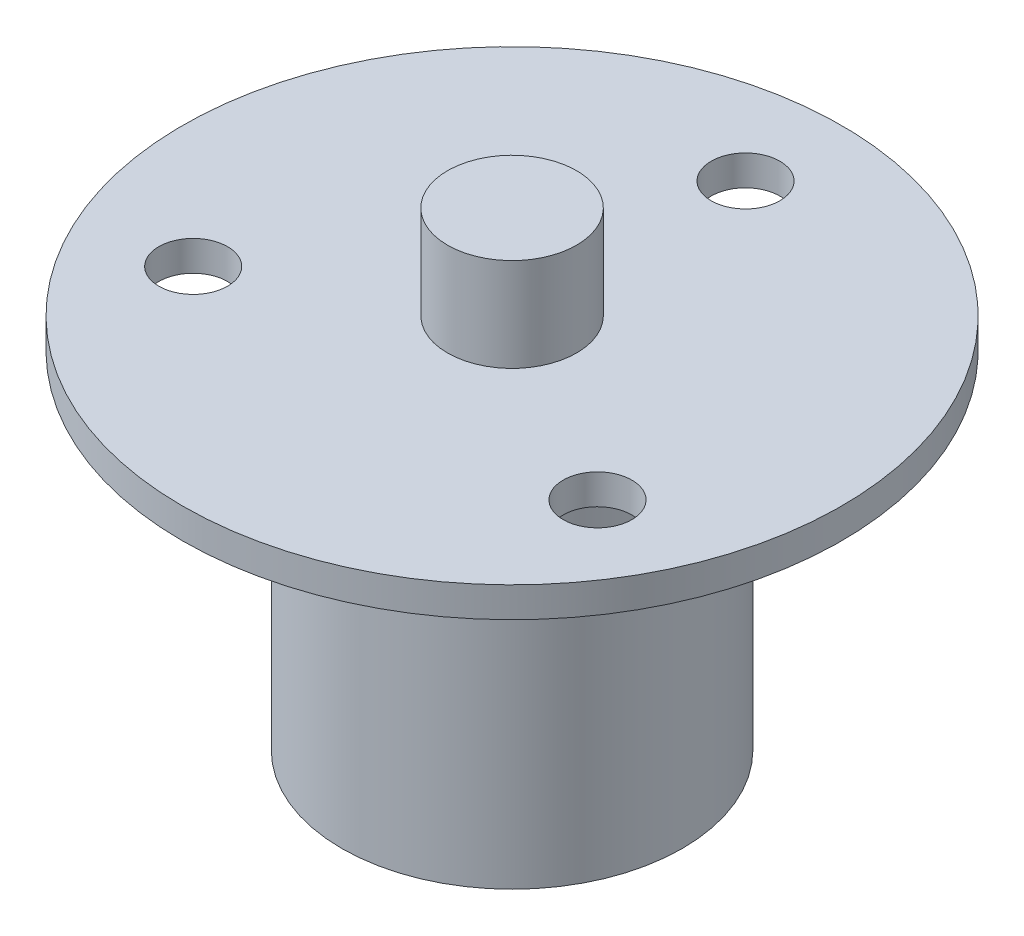
ISO-10303-21;
HEADER;
FILE_DESCRIPTION(('STEP AP214'),'2;1');
FILE_NAME('part.step','',(''),(''),'','','');
FILE_SCHEMA(('AUTOMOTIVE_DESIGN { 1 0 10303 214 1 1 1 1 }'));
ENDSEC;
DATA;
#1=APPLICATION_CONTEXT('core data for automotive mechanical design processes');
#2=APPLICATION_PROTOCOL_DEFINITION('international standard','automotive_design',2000,#1);
#3=PRODUCT_CONTEXT('',#1,'mechanical');
#4=PRODUCT('Part','Part','',(#3));
#5=PRODUCT_RELATED_PRODUCT_CATEGORY('part','',(#4));
#6=PRODUCT_DEFINITION_FORMATION('','',#4);
#7=PRODUCT_DEFINITION_CONTEXT('part definition',#1,'design');
#8=PRODUCT_DEFINITION('design','',#6,#7);
#9=PRODUCT_DEFINITION_SHAPE('','',#8);
#10=(LENGTH_UNIT() NAMED_UNIT(*) SI_UNIT(.MILLI.,.METRE.));
#11=(NAMED_UNIT(*) PLANE_ANGLE_UNIT() SI_UNIT($,.RADIAN.));
#12=(NAMED_UNIT(*) SI_UNIT($,.STERADIAN.) SOLID_ANGLE_UNIT());
#13=UNCERTAINTY_MEASURE_WITH_UNIT(LENGTH_MEASURE(1.E-05),#10,'distance_accuracy_value','');
#14=(GEOMETRIC_REPRESENTATION_CONTEXT(3) GLOBAL_UNCERTAINTY_ASSIGNED_CONTEXT((#13)) GLOBAL_UNIT_ASSIGNED_CONTEXT((#10,
#11,#12)) REPRESENTATION_CONTEXT('',''));
#15=CARTESIAN_POINT('',(0.,0.,0.));
#16=DIRECTION('',(0.,0.,1.));
#17=DIRECTION('',(1.,0.,0.));
#18=AXIS2_PLACEMENT_3D('',#15,#16,#17);
#19=CARTESIAN_POINT('',(0.,0.,0.));
#20=DIRECTION('',(0.,-1.,0.));
#21=DIRECTION('',(0.,0.,-1.));
#22=AXIS2_PLACEMENT_3D('',#19,#20,#21);
#23=PLANE('',#22);
#24=CARTESIAN_POINT('',(0.,0.,0.));
#25=DIRECTION('',(0.,1.,0.));
#26=DIRECTION('',(0.,0.,1.));
#27=AXIS2_PLACEMENT_3D('',#24,#25,#26);
#28=CIRCLE('',#27,6.2);
#29=CARTESIAN_POINT('',(0.,0.,6.2));
#30=VERTEX_POINT('',#29);
#31=EDGE_CURVE('E10',#30,#30,#28,.T.);
#32=ORIENTED_EDGE('',*,*,#31,.F.);
#33=EDGE_LOOP('',(#32));
#34=FACE_BOUND('',#33,.T.);
#35=ADVANCED_FACE('F33',(#34),#23,.T.);
#36=CARTESIAN_POINT('',(0.,17.1,0.));
#37=DIRECTION('',(0.,1.,0.));
#38=DIRECTION('',(0.,0.,1.));
#39=AXIS2_PLACEMENT_3D('',#36,#37,#38);
#40=CYLINDRICAL_SURFACE('',#39,6.2);
#41=ORIENTED_EDGE('',*,*,#31,.T.);
#42=EDGE_LOOP('',(#41));
#43=FACE_BOUND('',#42,.T.);
#44=CARTESIAN_POINT('',(0.,12.6,0.));
#45=DIRECTION('',(0.,1.,0.));
#46=DIRECTION('',(0.,0.,1.));
#47=AXIS2_PLACEMENT_3D('',#44,#45,#46);
#48=CIRCLE('',#47,6.2);
#49=CARTESIAN_POINT('',(0.,12.6,6.2));
#50=VERTEX_POINT('',#49);
#51=EDGE_CURVE('E39',#50,#50,#48,.T.);
#52=ORIENTED_EDGE('',*,*,#51,.F.);
#53=EDGE_LOOP('',(#52));
#54=FACE_BOUND('',#53,.T.);
#55=ADVANCED_FACE('F109',(#43,#54),#40,.T.);
#56=CARTESIAN_POINT('',(-6.2,12.6,0.));
#57=DIRECTION('',(0.,-1.,0.));
#58=DIRECTION('',(0.,0.,-1.));
#59=AXIS2_PLACEMENT_3D('',#56,#57,#58);
#60=PLANE('',#59);
#61=CARTESIAN_POINT('',(-7.36121593216719,12.6,4.25000000000032));
#62=DIRECTION('',(0.,-1.,0.));
#63=DIRECTION('',(0.,0.,-1.));
#64=AXIS2_PLACEMENT_3D('',#61,#62,#63);
#65=CIRCLE('',#64,1.25000000000069);
#66=CARTESIAN_POINT('',(-7.36121593216719,12.6,5.500000000001));
#67=VERTEX_POINT('',#66);
#68=EDGE_CURVE('E71',#67,#67,#65,.F.);
#69=ORIENTED_EDGE('',*,*,#68,.T.);
#70=EDGE_LOOP('',(#69));
#71=FACE_BOUND('',#70,.T.);
#72=CARTESIAN_POINT('',(7.36121593216827,12.6,4.24999999999969));
#73=DIRECTION('',(0.,-1.,0.));
#74=DIRECTION('',(0.,0.,-1.));
#75=AXIS2_PLACEMENT_3D('',#72,#73,#74);
#76=CIRCLE('',#75,1.25000000000047);
#77=CARTESIAN_POINT('',(7.36121593216827,12.6,5.50000000000015));
#78=VERTEX_POINT('',#77);
#79=EDGE_CURVE('E65',#78,#78,#76,.F.);
#80=ORIENTED_EDGE('',*,*,#79,.T.);
#81=EDGE_LOOP('',(#80));
#82=FACE_BOUND('',#81,.T.);
#83=CARTESIAN_POINT('',(0.,12.6,-8.5));
#84=DIRECTION('',(0.,-1.,0.));
#85=DIRECTION('',(0.,0.,-1.));
#86=AXIS2_PLACEMENT_3D('',#83,#84,#85);
#87=CIRCLE('',#86,1.25);
#88=CARTESIAN_POINT('',(0.,12.6,-7.25));
#89=VERTEX_POINT('',#88);
#90=EDGE_CURVE('E59',#89,#89,#87,.F.);
#91=ORIENTED_EDGE('',*,*,#90,.T.);
#92=EDGE_LOOP('',(#91));
#93=FACE_BOUND('',#92,.T.);
#94=ORIENTED_EDGE('',*,*,#51,.T.);
#95=EDGE_LOOP('',(#94));
#96=FACE_BOUND('',#95,.T.);
#97=CARTESIAN_POINT('',(0.,12.6,0.));
#98=DIRECTION('',(0.,1.,0.));
#99=DIRECTION('',(0.,0.,1.));
#100=AXIS2_PLACEMENT_3D('',#97,#98,#99);
#101=CIRCLE('',#100,12.);
#102=CARTESIAN_POINT('',(0.,12.6,12.));
#103=VERTEX_POINT('',#102);
#104=EDGE_CURVE('E43',#103,#103,#101,.T.);
#105=ORIENTED_EDGE('',*,*,#104,.F.);
#106=EDGE_LOOP('',(#105));
#107=FACE_BOUND('',#106,.T.);
#108=ADVANCED_FACE('F114',(#71,#82,#93,#96,#107),#60,.T.);
#109=CARTESIAN_POINT('',(0.,17.1,0.));
#110=DIRECTION('',(0.,1.,0.));
#111=DIRECTION('',(0.,0.,1.));
#112=AXIS2_PLACEMENT_3D('',#109,#110,#111);
#113=CYLINDRICAL_SURFACE('',#112,12.);
#114=ORIENTED_EDGE('',*,*,#104,.T.);
#115=EDGE_LOOP('',(#114));
#116=FACE_BOUND('',#115,.T.);
#117=CARTESIAN_POINT('',(0.,13.7,0.));
#118=DIRECTION('',(0.,1.,0.));
#119=DIRECTION('',(0.,0.,1.));
#120=AXIS2_PLACEMENT_3D('',#117,#118,#119);
#121=CIRCLE('',#120,12.);
#122=CARTESIAN_POINT('',(0.,13.7,12.));
#123=VERTEX_POINT('',#122);
#124=EDGE_CURVE('E47',#123,#123,#121,.T.);
#125=ORIENTED_EDGE('',*,*,#124,.F.);
#126=EDGE_LOOP('',(#125));
#127=FACE_BOUND('',#126,.T.);
#128=ADVANCED_FACE('F83',(#116,#127),#113,.T.);
#129=CARTESIAN_POINT('',(-12.,13.7,0.));
#130=DIRECTION('',(0.,1.,0.));
#131=DIRECTION('',(0.,0.,1.));
#132=AXIS2_PLACEMENT_3D('',#129,#130,#131);
#133=PLANE('',#132);
#134=CARTESIAN_POINT('',(-7.36121593216719,13.7,4.25000000000032));
#135=DIRECTION('',(0.,1.,0.));
#136=DIRECTION('',(0.,0.,1.));
#137=AXIS2_PLACEMENT_3D('',#134,#135,#136);
#138=CIRCLE('',#137,1.25000000000069);
#139=CARTESIAN_POINT('',(-7.36121593216719,13.7,5.500000000001));
#140=VERTEX_POINT('',#139);
#141=EDGE_CURVE('E68',#140,#140,#138,.T.);
#142=ORIENTED_EDGE('',*,*,#141,.F.);
#143=EDGE_LOOP('',(#142));
#144=FACE_BOUND('',#143,.T.);
#145=CARTESIAN_POINT('',(7.36121593216827,13.7,4.24999999999969));
#146=DIRECTION('',(0.,1.,0.));
#147=DIRECTION('',(0.,0.,1.));
#148=AXIS2_PLACEMENT_3D('',#145,#146,#147);
#149=CIRCLE('',#148,1.25000000000047);
#150=CARTESIAN_POINT('',(7.36121593216827,13.7,5.50000000000015));
#151=VERTEX_POINT('',#150);
#152=EDGE_CURVE('E62',#151,#151,#149,.T.);
#153=ORIENTED_EDGE('',*,*,#152,.F.);
#154=EDGE_LOOP('',(#153));
#155=FACE_BOUND('',#154,.T.);
#156=CARTESIAN_POINT('',(0.,13.7,-8.5));
#157=DIRECTION('',(0.,1.,0.));
#158=DIRECTION('',(0.,0.,1.));
#159=AXIS2_PLACEMENT_3D('',#156,#157,#158);
#160=CIRCLE('',#159,1.25);
#161=CARTESIAN_POINT('',(0.,13.7,-7.25));
#162=VERTEX_POINT('',#161);
#163=EDGE_CURVE('E58',#162,#162,#160,.T.);
#164=ORIENTED_EDGE('',*,*,#163,.F.);
#165=EDGE_LOOP('',(#164));
#166=FACE_BOUND('',#165,.T.);
#167=ORIENTED_EDGE('',*,*,#124,.T.);
#168=EDGE_LOOP('',(#167));
#169=FACE_BOUND('',#168,.T.);
#170=CARTESIAN_POINT('',(0.,13.7,0.));
#171=DIRECTION('',(0.,1.,0.));
#172=DIRECTION('',(0.,0.,1.));
#173=AXIS2_PLACEMENT_3D('',#170,#171,#172);
#174=CIRCLE('',#173,2.35);
#175=CARTESIAN_POINT('',(0.,13.7,2.35));
#176=VERTEX_POINT('',#175);
#177=EDGE_CURVE('E52',#176,#176,#174,.T.);
#178=ORIENTED_EDGE('',*,*,#177,.F.);
#179=EDGE_LOOP('',(#178));
#180=FACE_BOUND('',#179,.T.);
#181=ADVANCED_FACE('F79',(#144,#155,#166,#169,#180),#133,.T.);
#182=CARTESIAN_POINT('',(0.,17.1,0.));
#183=DIRECTION('',(0.,1.,0.));
#184=DIRECTION('',(0.,0.,1.));
#185=AXIS2_PLACEMENT_3D('',#182,#183,#184);
#186=CYLINDRICAL_SURFACE('',#185,2.35);
#187=ORIENTED_EDGE('',*,*,#177,.T.);
#188=EDGE_LOOP('',(#187));
#189=FACE_BOUND('',#188,.T.);
#190=CARTESIAN_POINT('',(0.,17.1,0.));
#191=DIRECTION('',(0.,1.,0.));
#192=DIRECTION('',(0.,0.,1.));
#193=AXIS2_PLACEMENT_3D('',#190,#191,#192);
#194=CIRCLE('',#193,2.35);
#195=CARTESIAN_POINT('',(0.,17.1,2.35));
#196=VERTEX_POINT('',#195);
#197=EDGE_CURVE('E55',#196,#196,#194,.T.);
#198=ORIENTED_EDGE('',*,*,#197,.F.);
#199=EDGE_LOOP('',(#198));
#200=FACE_BOUND('',#199,.T.);
#201=ADVANCED_FACE('F82',(#189,#200),#186,.T.);
#202=CARTESIAN_POINT('',(-2.35,17.1,0.));
#203=DIRECTION('',(0.,1.,0.));
#204=DIRECTION('',(0.,0.,1.));
#205=AXIS2_PLACEMENT_3D('',#202,#203,#204);
#206=PLANE('',#205);
#207=ORIENTED_EDGE('',*,*,#197,.T.);
#208=EDGE_LOOP('',(#207));
#209=FACE_BOUND('',#208,.T.);
#210=ADVANCED_FACE('F95',(#209),#206,.T.);
#211=CARTESIAN_POINT('',(0.,-0.000999999999999265,-8.5));
#212=DIRECTION('',(0.,1.,0.));
#213=DIRECTION('',(0.,0.,1.));
#214=AXIS2_PLACEMENT_3D('',#211,#212,#213);
#215=CYLINDRICAL_SURFACE('',#214,1.25);
#216=CARTESIAN_POINT('',(0.,12.6,-7.25));
#217=CARTESIAN_POINT('',(0.,12.6114583333333,-7.25));
#218=CARTESIAN_POINT('',(0.,12.6229166666667,-7.25));
#219=CARTESIAN_POINT('',(0.,12.6458333333333,-7.25));
#220=CARTESIAN_POINT('',(0.,12.6572916666667,-7.25));
#221=CARTESIAN_POINT('',(0.,12.6802083333333,-7.25));
#222=CARTESIAN_POINT('',(0.,12.6916666666667,-7.25));
#223=CARTESIAN_POINT('',(0.,12.7145833333333,-7.25));
#224=CARTESIAN_POINT('',(0.,12.7260416666667,-7.25));
#225=CARTESIAN_POINT('',(0.,12.7489583333333,-7.25));
#226=CARTESIAN_POINT('',(0.,12.7604166666667,-7.25));
#227=CARTESIAN_POINT('',(0.,12.7833333333333,-7.25));
#228=CARTESIAN_POINT('',(0.,12.7947916666667,-7.25));
#229=CARTESIAN_POINT('',(0.,12.8177083333333,-7.25));
#230=CARTESIAN_POINT('',(0.,12.8291666666667,-7.25));
#231=CARTESIAN_POINT('',(0.,12.8520833333333,-7.25));
#232=CARTESIAN_POINT('',(0.,12.8635416666667,-7.25));
#233=CARTESIAN_POINT('',(0.,12.8864583333333,-7.25));
#234=CARTESIAN_POINT('',(0.,12.8979166666667,-7.25));
#235=CARTESIAN_POINT('',(0.,12.9208333333333,-7.25));
#236=CARTESIAN_POINT('',(0.,12.9322916666667,-7.25));
#237=CARTESIAN_POINT('',(0.,12.9552083333333,-7.25));
#238=CARTESIAN_POINT('',(0.,12.9666666666667,-7.25));
#239=CARTESIAN_POINT('',(0.,12.9895833333333,-7.25));
#240=CARTESIAN_POINT('',(0.,13.0010416666667,-7.25));
#241=CARTESIAN_POINT('',(0.,13.0239583333333,-7.25));
#242=CARTESIAN_POINT('',(0.,13.0354166666667,-7.25));
#243=CARTESIAN_POINT('',(0.,13.0583333333333,-7.25));
#244=CARTESIAN_POINT('',(0.,13.0697916666667,-7.25));
#245=CARTESIAN_POINT('',(0.,13.0927083333333,-7.25));
#246=CARTESIAN_POINT('',(0.,13.1041666666667,-7.25));
#247=CARTESIAN_POINT('',(0.,13.1270833333333,-7.25));
#248=CARTESIAN_POINT('',(0.,13.1385416666667,-7.25));
#249=CARTESIAN_POINT('',(0.,13.1614583333333,-7.25));
#250=CARTESIAN_POINT('',(0.,13.1729166666667,-7.25));
#251=CARTESIAN_POINT('',(0.,13.1958333333333,-7.25));
#252=CARTESIAN_POINT('',(0.,13.2072916666667,-7.25));
#253=CARTESIAN_POINT('',(0.,13.2302083333333,-7.25));
#254=CARTESIAN_POINT('',(0.,13.2416666666667,-7.25));
#255=CARTESIAN_POINT('',(0.,13.2645833333333,-7.25));
#256=CARTESIAN_POINT('',(0.,13.2760416666667,-7.25));
#257=CARTESIAN_POINT('',(0.,13.2989583333333,-7.25));
#258=CARTESIAN_POINT('',(0.,13.3104166666667,-7.25));
#259=CARTESIAN_POINT('',(0.,13.3333333333333,-7.25));
#260=CARTESIAN_POINT('',(0.,13.3447916666667,-7.25));
#261=CARTESIAN_POINT('',(0.,13.3677083333333,-7.25));
#262=CARTESIAN_POINT('',(0.,13.3791666666667,-7.25));
#263=CARTESIAN_POINT('',(0.,13.4020833333333,-7.25));
#264=CARTESIAN_POINT('',(0.,13.4135416666667,-7.25));
#265=CARTESIAN_POINT('',(0.,13.4364583333333,-7.25));
#266=CARTESIAN_POINT('',(0.,13.4479166666667,-7.25));
#267=CARTESIAN_POINT('',(0.,13.4708333333333,-7.25));
#268=CARTESIAN_POINT('',(0.,13.4822916666667,-7.25));
#269=CARTESIAN_POINT('',(0.,13.5052083333333,-7.25));
#270=CARTESIAN_POINT('',(0.,13.5166666666667,-7.25));
#271=CARTESIAN_POINT('',(0.,13.5395833333333,-7.25));
#272=CARTESIAN_POINT('',(0.,13.5510416666667,-7.25));
#273=CARTESIAN_POINT('',(0.,13.5739583333333,-7.25));
#274=CARTESIAN_POINT('',(0.,13.5854166666667,-7.25));
#275=CARTESIAN_POINT('',(0.,13.6083333333333,-7.25));
#276=CARTESIAN_POINT('',(0.,13.6197916666667,-7.25));
#277=CARTESIAN_POINT('',(0.,13.6427083333333,-7.25));
#278=CARTESIAN_POINT('',(0.,13.6541666666667,-7.25));
#279=CARTESIAN_POINT('',(0.,13.6770833333333,-7.25));
#280=CARTESIAN_POINT('',(0.,13.6885416666667,-7.25));
#281=CARTESIAN_POINT('',(0.,13.7,-7.25));
#282=B_SPLINE_CURVE_WITH_KNOTS('',3,(#216,#217,#218,#219,#220,#221,#222,#223,#224,#225,#226,
#227,#228,#229,#230,#231,#232,#233,#234,#235,#236,#237,#238,#239,#240,#241,#242,#243,#244,#245,
#246,#247,#248,#249,#250,#251,#252,#253,#254,#255,#256,#257,#258,#259,#260,#261,#262,#263,#264,
#265,#266,#267,#268,#269,#270,#271,#272,#273,#274,#275,#276,#277,#278,#279,#280,#281),
.UNSPECIFIED.,.F.,.F.,(4,2,2,2,2,2,2,2,2,2,2,2,2,2,2,2,2,2,2,2,2,2,2,2,2,2,2,2,2,2,2,2,4),(0.,
0.0343749999999997,0.0687499999999994,0.103125000000001,0.1375,0.171875,0.20625,0.240625,
0.275000000000001,0.309375000000001,0.34375,0.378125,0.4125,0.446874999999999,0.481250000000001,
0.515625,0.55,0.584375,0.618749999999999,0.653125000000001,0.687500000000001,0.721875,0.75625,
0.790625,0.824999999999999,0.859375000000001,0.89375,0.928125,0.9625,0.996875000000001,1.03125,
1.065625,1.1),.UNSPECIFIED.);
#283=EDGE_CURVE('BSEAM100',#89,#162,#282,.T.);
#284=ORIENTED_EDGE('',*,*,#90,.F.);
#285=ORIENTED_EDGE('',*,*,#163,.T.);
#286=ORIENTED_EDGE('',*,*,#283,.T.);
#287=ORIENTED_EDGE('',*,*,#283,.F.);
#288=EDGE_LOOP('',(#284,#286,#285,#287));
#289=FACE_BOUND('',#288,.T.);
#290=ADVANCED_FACE('F100',(#289),#215,.F.);
#291=CARTESIAN_POINT('',(7.36121593216827,-0.000999999999999265,4.24999999999969));
#292=DIRECTION('',(0.,1.,0.));
#293=DIRECTION('',(0.,0.,1.));
#294=AXIS2_PLACEMENT_3D('',#291,#292,#293);
#295=CYLINDRICAL_SURFACE('',#294,1.25000000000047);
#296=CARTESIAN_POINT('',(7.36121593216827,12.6,5.50000000000015));
#297=CARTESIAN_POINT('',(7.36121593216827,12.6114583333333,5.50000000000015));
#298=CARTESIAN_POINT('',(7.36121593216827,12.6229166666667,5.50000000000015));
#299=CARTESIAN_POINT('',(7.36121593216827,12.6458333333333,5.50000000000015));
#300=CARTESIAN_POINT('',(7.36121593216827,12.6572916666667,5.50000000000015));
#301=CARTESIAN_POINT('',(7.36121593216827,12.6802083333333,5.50000000000015));
#302=CARTESIAN_POINT('',(7.36121593216827,12.6916666666667,5.50000000000015));
#303=CARTESIAN_POINT('',(7.36121593216827,12.7145833333333,5.50000000000015));
#304=CARTESIAN_POINT('',(7.36121593216827,12.7260416666667,5.50000000000015));
#305=CARTESIAN_POINT('',(7.36121593216827,12.7489583333333,5.50000000000015));
#306=CARTESIAN_POINT('',(7.36121593216827,12.7604166666667,5.50000000000015));
#307=CARTESIAN_POINT('',(7.36121593216827,12.7833333333333,5.50000000000015));
#308=CARTESIAN_POINT('',(7.36121593216827,12.7947916666667,5.50000000000015));
#309=CARTESIAN_POINT('',(7.36121593216827,12.8177083333333,5.50000000000015));
#310=CARTESIAN_POINT('',(7.36121593216827,12.8291666666667,5.50000000000015));
#311=CARTESIAN_POINT('',(7.36121593216827,12.8520833333333,5.50000000000015));
#312=CARTESIAN_POINT('',(7.36121593216827,12.8635416666667,5.50000000000015));
#313=CARTESIAN_POINT('',(7.36121593216827,12.8864583333333,5.50000000000015));
#314=CARTESIAN_POINT('',(7.36121593216827,12.8979166666667,5.50000000000015));
#315=CARTESIAN_POINT('',(7.36121593216827,12.9208333333333,5.50000000000015));
#316=CARTESIAN_POINT('',(7.36121593216827,12.9322916666667,5.50000000000015));
#317=CARTESIAN_POINT('',(7.36121593216827,12.9552083333333,5.50000000000015));
#318=CARTESIAN_POINT('',(7.36121593216827,12.9666666666667,5.50000000000015));
#319=CARTESIAN_POINT('',(7.36121593216827,12.9895833333333,5.50000000000015));
#320=CARTESIAN_POINT('',(7.36121593216827,13.0010416666667,5.50000000000015));
#321=CARTESIAN_POINT('',(7.36121593216827,13.0239583333333,5.50000000000015));
#322=CARTESIAN_POINT('',(7.36121593216827,13.0354166666667,5.50000000000015));
#323=CARTESIAN_POINT('',(7.36121593216827,13.0583333333333,5.50000000000015));
#324=CARTESIAN_POINT('',(7.36121593216827,13.0697916666667,5.50000000000015));
#325=CARTESIAN_POINT('',(7.36121593216827,13.0927083333333,5.50000000000015));
#326=CARTESIAN_POINT('',(7.36121593216827,13.1041666666667,5.50000000000015));
#327=CARTESIAN_POINT('',(7.36121593216827,13.1270833333333,5.50000000000015));
#328=CARTESIAN_POINT('',(7.36121593216827,13.1385416666667,5.50000000000015));
#329=CARTESIAN_POINT('',(7.36121593216827,13.1614583333333,5.50000000000015));
#330=CARTESIAN_POINT('',(7.36121593216827,13.1729166666667,5.50000000000015));
#331=CARTESIAN_POINT('',(7.36121593216827,13.1958333333333,5.50000000000015));
#332=CARTESIAN_POINT('',(7.36121593216827,13.2072916666667,5.50000000000015));
#333=CARTESIAN_POINT('',(7.36121593216827,13.2302083333333,5.50000000000015));
#334=CARTESIAN_POINT('',(7.36121593216827,13.2416666666667,5.50000000000015));
#335=CARTESIAN_POINT('',(7.36121593216827,13.2645833333333,5.50000000000015));
#336=CARTESIAN_POINT('',(7.36121593216827,13.2760416666667,5.50000000000015));
#337=CARTESIAN_POINT('',(7.36121593216827,13.2989583333333,5.50000000000015));
#338=CARTESIAN_POINT('',(7.36121593216827,13.3104166666667,5.50000000000015));
#339=CARTESIAN_POINT('',(7.36121593216827,13.3333333333333,5.50000000000015));
#340=CARTESIAN_POINT('',(7.36121593216827,13.3447916666667,5.50000000000015));
#341=CARTESIAN_POINT('',(7.36121593216827,13.3677083333333,5.50000000000015));
#342=CARTESIAN_POINT('',(7.36121593216827,13.3791666666667,5.50000000000015));
#343=CARTESIAN_POINT('',(7.36121593216827,13.4020833333333,5.50000000000015));
#344=CARTESIAN_POINT('',(7.36121593216827,13.4135416666667,5.50000000000015));
#345=CARTESIAN_POINT('',(7.36121593216827,13.4364583333333,5.50000000000015));
#346=CARTESIAN_POINT('',(7.36121593216827,13.4479166666667,5.50000000000015));
#347=CARTESIAN_POINT('',(7.36121593216827,13.4708333333333,5.50000000000015));
#348=CARTESIAN_POINT('',(7.36121593216827,13.4822916666667,5.50000000000015));
#349=CARTESIAN_POINT('',(7.36121593216827,13.5052083333333,5.50000000000015));
#350=CARTESIAN_POINT('',(7.36121593216827,13.5166666666667,5.50000000000015));
#351=CARTESIAN_POINT('',(7.36121593216827,13.5395833333333,5.50000000000015));
#352=CARTESIAN_POINT('',(7.36121593216827,13.5510416666667,5.50000000000015));
#353=CARTESIAN_POINT('',(7.36121593216827,13.5739583333333,5.50000000000015));
#354=CARTESIAN_POINT('',(7.36121593216827,13.5854166666667,5.50000000000015));
#355=CARTESIAN_POINT('',(7.36121593216827,13.6083333333333,5.50000000000015));
#356=CARTESIAN_POINT('',(7.36121593216827,13.6197916666667,5.50000000000015));
#357=CARTESIAN_POINT('',(7.36121593216827,13.6427083333333,5.50000000000015));
#358=CARTESIAN_POINT('',(7.36121593216827,13.6541666666667,5.50000000000015));
#359=CARTESIAN_POINT('',(7.36121593216827,13.6770833333333,5.50000000000015));
#360=CARTESIAN_POINT('',(7.36121593216827,13.6885416666667,5.50000000000015));
#361=CARTESIAN_POINT('',(7.36121593216827,13.7,5.50000000000015));
#362=B_SPLINE_CURVE_WITH_KNOTS('',3,(#296,#297,#298,#299,#300,#301,#302,#303,#304,#305,#306,
#307,#308,#309,#310,#311,#312,#313,#314,#315,#316,#317,#318,#319,#320,#321,#322,#323,#324,#325,
#326,#327,#328,#329,#330,#331,#332,#333,#334,#335,#336,#337,#338,#339,#340,#341,#342,#343,#344,
#345,#346,#347,#348,#349,#350,#351,#352,#353,#354,#355,#356,#357,#358,#359,#360,#361),
.UNSPECIFIED.,.F.,.F.,(4,2,2,2,2,2,2,2,2,2,2,2,2,2,2,2,2,2,2,2,2,2,2,2,2,2,2,2,2,2,2,2,4),(0.,
0.0343749999999997,0.0687499999999994,0.103125000000001,0.1375,0.171875,0.20625,0.240625,
0.275000000000001,0.309375000000001,0.34375,0.378125,0.4125,0.446874999999999,0.481250000000001,
0.515625,0.55,0.584375,0.618749999999999,0.653125000000001,0.687500000000001,0.721875,0.75625,
0.790625,0.824999999999999,0.859375000000001,0.89375,0.928125,0.9625,0.996875000000001,1.03125,
1.065625,1.1),.UNSPECIFIED.);
#363=EDGE_CURVE('BSEAM105',#78,#151,#362,.T.);
#364=ORIENTED_EDGE('',*,*,#79,.F.);
#365=ORIENTED_EDGE('',*,*,#152,.T.);
#366=ORIENTED_EDGE('',*,*,#363,.T.);
#367=ORIENTED_EDGE('',*,*,#363,.F.);
#368=EDGE_LOOP('',(#364,#366,#365,#367));
#369=FACE_BOUND('',#368,.T.);
#370=ADVANCED_FACE('F105',(#369),#295,.F.);
#371=CARTESIAN_POINT('',(-7.36121593216719,-0.000999999999999265,4.25000000000032));
#372=DIRECTION('',(0.,1.,0.));
#373=DIRECTION('',(0.,0.,1.));
#374=AXIS2_PLACEMENT_3D('',#371,#372,#373);
#375=CYLINDRICAL_SURFACE('',#374,1.25000000000069);
#376=CARTESIAN_POINT('',(-7.36121593216719,12.6,5.500000000001));
#377=CARTESIAN_POINT('',(-7.36121593216719,12.6114583333333,5.500000000001));
#378=CARTESIAN_POINT('',(-7.36121593216719,12.6229166666667,5.500000000001));
#379=CARTESIAN_POINT('',(-7.36121593216719,12.6458333333333,5.500000000001));
#380=CARTESIAN_POINT('',(-7.36121593216719,12.6572916666667,5.500000000001));
#381=CARTESIAN_POINT('',(-7.36121593216719,12.6802083333333,5.500000000001));
#382=CARTESIAN_POINT('',(-7.36121593216719,12.6916666666667,5.500000000001));
#383=CARTESIAN_POINT('',(-7.36121593216719,12.7145833333333,5.500000000001));
#384=CARTESIAN_POINT('',(-7.36121593216719,12.7260416666667,5.500000000001));
#385=CARTESIAN_POINT('',(-7.36121593216719,12.7489583333333,5.500000000001));
#386=CARTESIAN_POINT('',(-7.36121593216719,12.7604166666667,5.500000000001));
#387=CARTESIAN_POINT('',(-7.36121593216719,12.7833333333333,5.500000000001));
#388=CARTESIAN_POINT('',(-7.36121593216719,12.7947916666667,5.500000000001));
#389=CARTESIAN_POINT('',(-7.36121593216719,12.8177083333333,5.500000000001));
#390=CARTESIAN_POINT('',(-7.36121593216719,12.8291666666667,5.500000000001));
#391=CARTESIAN_POINT('',(-7.36121593216719,12.8520833333333,5.500000000001));
#392=CARTESIAN_POINT('',(-7.36121593216719,12.8635416666667,5.500000000001));
#393=CARTESIAN_POINT('',(-7.36121593216719,12.8864583333333,5.500000000001));
#394=CARTESIAN_POINT('',(-7.36121593216719,12.8979166666667,5.500000000001));
#395=CARTESIAN_POINT('',(-7.36121593216719,12.9208333333333,5.500000000001));
#396=CARTESIAN_POINT('',(-7.36121593216719,12.9322916666667,5.500000000001));
#397=CARTESIAN_POINT('',(-7.36121593216719,12.9552083333333,5.500000000001));
#398=CARTESIAN_POINT('',(-7.36121593216719,12.9666666666667,5.500000000001));
#399=CARTESIAN_POINT('',(-7.36121593216719,12.9895833333333,5.500000000001));
#400=CARTESIAN_POINT('',(-7.36121593216719,13.0010416666667,5.500000000001));
#401=CARTESIAN_POINT('',(-7.36121593216719,13.0239583333333,5.500000000001));
#402=CARTESIAN_POINT('',(-7.36121593216719,13.0354166666667,5.500000000001));
#403=CARTESIAN_POINT('',(-7.36121593216719,13.0583333333333,5.500000000001));
#404=CARTESIAN_POINT('',(-7.36121593216719,13.0697916666667,5.500000000001));
#405=CARTESIAN_POINT('',(-7.36121593216719,13.0927083333333,5.500000000001));
#406=CARTESIAN_POINT('',(-7.36121593216719,13.1041666666667,5.500000000001));
#407=CARTESIAN_POINT('',(-7.36121593216719,13.1270833333333,5.500000000001));
#408=CARTESIAN_POINT('',(-7.36121593216719,13.1385416666667,5.500000000001));
#409=CARTESIAN_POINT('',(-7.36121593216719,13.1614583333333,5.500000000001));
#410=CARTESIAN_POINT('',(-7.36121593216719,13.1729166666667,5.500000000001));
#411=CARTESIAN_POINT('',(-7.36121593216719,13.1958333333333,5.500000000001));
#412=CARTESIAN_POINT('',(-7.36121593216719,13.2072916666667,5.500000000001));
#413=CARTESIAN_POINT('',(-7.36121593216719,13.2302083333333,5.500000000001));
#414=CARTESIAN_POINT('',(-7.36121593216719,13.2416666666667,5.500000000001));
#415=CARTESIAN_POINT('',(-7.36121593216719,13.2645833333333,5.500000000001));
#416=CARTESIAN_POINT('',(-7.36121593216719,13.2760416666667,5.500000000001));
#417=CARTESIAN_POINT('',(-7.36121593216719,13.2989583333333,5.500000000001));
#418=CARTESIAN_POINT('',(-7.36121593216719,13.3104166666667,5.500000000001));
#419=CARTESIAN_POINT('',(-7.36121593216719,13.3333333333333,5.500000000001));
#420=CARTESIAN_POINT('',(-7.36121593216719,13.3447916666667,5.500000000001));
#421=CARTESIAN_POINT('',(-7.36121593216719,13.3677083333333,5.500000000001));
#422=CARTESIAN_POINT('',(-7.36121593216719,13.3791666666667,5.500000000001));
#423=CARTESIAN_POINT('',(-7.36121593216719,13.4020833333333,5.500000000001));
#424=CARTESIAN_POINT('',(-7.36121593216719,13.4135416666667,5.500000000001));
#425=CARTESIAN_POINT('',(-7.36121593216719,13.4364583333333,5.500000000001));
#426=CARTESIAN_POINT('',(-7.36121593216719,13.4479166666667,5.500000000001));
#427=CARTESIAN_POINT('',(-7.36121593216719,13.4708333333333,5.500000000001));
#428=CARTESIAN_POINT('',(-7.36121593216719,13.4822916666667,5.500000000001));
#429=CARTESIAN_POINT('',(-7.36121593216719,13.5052083333333,5.500000000001));
#430=CARTESIAN_POINT('',(-7.36121593216719,13.5166666666667,5.500000000001));
#431=CARTESIAN_POINT('',(-7.36121593216719,13.5395833333333,5.500000000001));
#432=CARTESIAN_POINT('',(-7.36121593216719,13.5510416666667,5.500000000001));
#433=CARTESIAN_POINT('',(-7.36121593216719,13.5739583333333,5.500000000001));
#434=CARTESIAN_POINT('',(-7.36121593216719,13.5854166666667,5.500000000001));
#435=CARTESIAN_POINT('',(-7.36121593216719,13.6083333333333,5.500000000001));
#436=CARTESIAN_POINT('',(-7.36121593216719,13.6197916666667,5.500000000001));
#437=CARTESIAN_POINT('',(-7.36121593216719,13.6427083333333,5.500000000001));
#438=CARTESIAN_POINT('',(-7.36121593216719,13.6541666666667,5.500000000001));
#439=CARTESIAN_POINT('',(-7.36121593216719,13.6770833333333,5.500000000001));
#440=CARTESIAN_POINT('',(-7.36121593216719,13.6885416666667,5.500000000001));
#441=CARTESIAN_POINT('',(-7.36121593216719,13.7,5.500000000001));
#442=B_SPLINE_CURVE_WITH_KNOTS('',3,(#376,#377,#378,#379,#380,#381,#382,#383,#384,#385,#386,
#387,#388,#389,#390,#391,#392,#393,#394,#395,#396,#397,#398,#399,#400,#401,#402,#403,#404,#405,
#406,#407,#408,#409,#410,#411,#412,#413,#414,#415,#416,#417,#418,#419,#420,#421,#422,#423,#424,
#425,#426,#427,#428,#429,#430,#431,#432,#433,#434,#435,#436,#437,#438,#439,#440,#441),
.UNSPECIFIED.,.F.,.F.,(4,2,2,2,2,2,2,2,2,2,2,2,2,2,2,2,2,2,2,2,2,2,2,2,2,2,2,2,2,2,2,2,4),(0.,
0.0343749999999997,0.0687499999999994,0.103125000000001,0.1375,0.171875,0.20625,0.240625,
0.275000000000001,0.309375000000001,0.34375,0.378125,0.4125,0.446874999999999,0.481250000000001,
0.515625,0.55,0.584375,0.618749999999999,0.653125000000001,0.687500000000001,0.721875,0.75625,
0.790625,0.824999999999999,0.859375000000001,0.89375,0.928125,0.9625,0.996875000000001,1.03125,
1.065625,1.1),.UNSPECIFIED.);
#443=EDGE_CURVE('BSEAM77',#67,#140,#442,.T.);
#444=ORIENTED_EDGE('',*,*,#68,.F.);
#445=ORIENTED_EDGE('',*,*,#141,.T.);
#446=ORIENTED_EDGE('',*,*,#443,.T.);
#447=ORIENTED_EDGE('',*,*,#443,.F.);
#448=EDGE_LOOP('',(#444,#446,#445,#447));
#449=FACE_BOUND('',#448,.T.);
#450=ADVANCED_FACE('F77',(#449),#375,.F.);
#451=CLOSED_SHELL('',(#35,#55,#108,#128,#181,#201,#210,#290,#370,#450));
#452=MANIFOLD_SOLID_BREP('B2',#451);
#453=ADVANCED_BREP_SHAPE_REPRESENTATION('',(#18,#452),#14);
#454=SHAPE_DEFINITION_REPRESENTATION(#9,#453);
ENDSEC;
END-ISO-10303-21;
